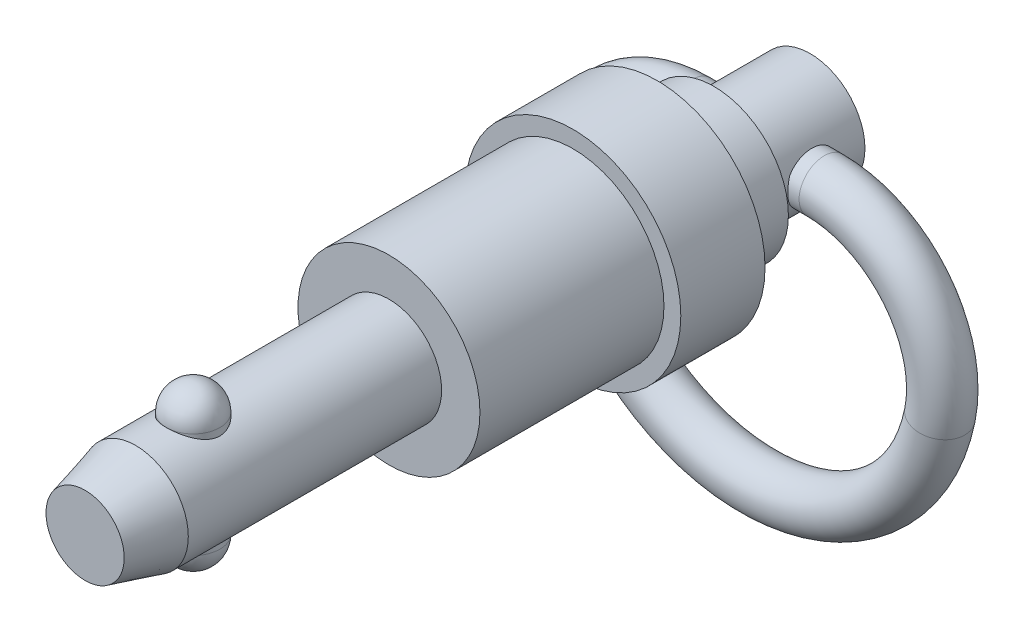
ISO-10303-21;
HEADER;
FILE_DESCRIPTION(('STEP AP214'),'2;1');
FILE_NAME('part.step','',(''),(''),'','','');
FILE_SCHEMA(('AUTOMOTIVE_DESIGN { 1 0 10303 214 1 1 1 1 }'));
ENDSEC;
DATA;
#1=APPLICATION_CONTEXT('core data for automotive mechanical design processes');
#2=APPLICATION_PROTOCOL_DEFINITION('international standard','automotive_design',2000,#1);
#3=PRODUCT_CONTEXT('',#1,'mechanical');
#4=PRODUCT('Part','Part','',(#3));
#5=PRODUCT_RELATED_PRODUCT_CATEGORY('part','',(#4));
#6=PRODUCT_DEFINITION_FORMATION('','',#4);
#7=PRODUCT_DEFINITION_CONTEXT('part definition',#1,'design');
#8=PRODUCT_DEFINITION('design','',#6,#7);
#9=PRODUCT_DEFINITION_SHAPE('','',#8);
#10=(LENGTH_UNIT() NAMED_UNIT(*) SI_UNIT(.MILLI.,.METRE.));
#11=(NAMED_UNIT(*) PLANE_ANGLE_UNIT() SI_UNIT($,.RADIAN.));
#12=(NAMED_UNIT(*) SI_UNIT($,.STERADIAN.) SOLID_ANGLE_UNIT());
#13=UNCERTAINTY_MEASURE_WITH_UNIT(LENGTH_MEASURE(1.E-05),#10,'distance_accuracy_value','');
#14=(GEOMETRIC_REPRESENTATION_CONTEXT(3) GLOBAL_UNCERTAINTY_ASSIGNED_CONTEXT((#13)) GLOBAL_UNIT_ASSIGNED_CONTEXT((#10,
#11,#12)) REPRESENTATION_CONTEXT('',''));
#15=CARTESIAN_POINT('',(0.,0.,0.));
#16=DIRECTION('',(0.,0.,1.));
#17=DIRECTION('',(1.,0.,0.));
#18=AXIS2_PLACEMENT_3D('',#15,#16,#17);
#19=CARTESIAN_POINT('',(0.,0.,6.25428571428572));
#20=DIRECTION('',(0.,0.,1.));
#21=DIRECTION('',(1.,0.,0.));
#22=AXIS2_PLACEMENT_3D('',#19,#20,#21);
#23=CYLINDRICAL_SURFACE('',#22,3.25);
#24=CARTESIAN_POINT('',(-2.88314064866769,1.50000000000001,-39.956));
#25=CARTESIAN_POINT('',(-2.8831457136264,1.49999556641994,-39.8769439023726));
#26=CARTESIAN_POINT('',(-2.88644015844544,1.49370969693479,-39.7977678873659));
#27=CARTESIAN_POINT('',(-2.89916399453696,1.46885414761838,-39.6417751471036));
#28=CARTESIAN_POINT('',(-2.9086081757042,1.45025485263673,-39.5649645782642));
#29=CARTESIAN_POINT('',(-2.93231396336259,1.4016968736993,-39.4162446356748));
#30=CARTESIAN_POINT('',(-2.9465528533482,1.37179167466407,-39.3443140372731));
#31=CARTESIAN_POINT('',(-2.9782090887604,1.30163233654913,-39.2065085108532));
#32=CARTESIAN_POINT('',(-2.99562617608213,1.26137903774135,-39.1406330917403));
#33=CARTESIAN_POINT('',(-3.03316714708754,1.16836618134816,-39.0117173133267));
#34=CARTESIAN_POINT('',(-3.05339509066289,1.11493024482924,-38.9491950168423));
#35=CARTESIAN_POINT('',(-3.09343234273965,0.998482280785288,-38.8336061903648));
#36=CARTESIAN_POINT('',(-3.11324146363631,0.935466061279206,-38.7805438218809));
#37=CARTESIAN_POINT('',(-3.15152392195906,0.797372263715609,-38.6825193567671));
#38=CARTESIAN_POINT('',(-3.16986256926451,0.72182005107809,-38.6381684379312));
#39=CARTESIAN_POINT('',(-3.20182516260171,0.563324090920352,-38.5630374816506));
#40=CARTESIAN_POINT('',(-3.21545165364737,0.480384363900056,-38.5322501161236));
#41=CARTESIAN_POINT('',(-3.23571086174561,0.314933648113417,-38.4870868303177));
#42=CARTESIAN_POINT('',(-3.24272563710553,0.232716432643617,-38.4718097892477));
#43=CARTESIAN_POINT('',(-3.25037878818967,0.0666076979909198,-38.4551600478439));
#44=CARTESIAN_POINT('',(-3.25102038740195,-0.0172829532677052,-38.4537803183854));
#45=CARTESIAN_POINT('',(-3.2460575180355,-0.177691624209244,-38.4645559898147));
#46=CARTESIAN_POINT('',(-3.24091400620298,-0.254293968157477,-38.4757124460504));
#47=CARTESIAN_POINT('',(-3.22562512287075,-0.404395406998716,-38.509492667503));
#48=CARTESIAN_POINT('',(-3.21547938016454,-0.477894271148601,-38.5321172837547));
#49=CARTESIAN_POINT('',(-3.19094774192041,-0.621056530120156,-38.5884120372744));
#50=CARTESIAN_POINT('',(-3.17650045920505,-0.690645751763829,-38.6222429450804));
#51=CARTESIAN_POINT('',(-3.14472149367112,-0.823340056563816,-38.6998059016657));
#52=CARTESIAN_POINT('',(-3.12738875365795,-0.886442749382061,-38.7435415815509));
#53=CARTESIAN_POINT('',(-3.08981116071687,-1.00998865129198,-38.8438963875093));
#54=CARTESIAN_POINT('',(-3.06944399350116,-1.06976897732309,-38.901286703642));
#55=CARTESIAN_POINT('',(-3.02909824323477,-1.17918246727279,-39.0252114945021));
#56=CARTESIAN_POINT('',(-3.00911988962755,-1.22880979481938,-39.0917511921404));
#57=CARTESIAN_POINT('',(-2.970824723522,-1.31879065623882,-39.2360306278498));
#58=CARTESIAN_POINT('',(-2.95263289679022,-1.35858783900657,-39.3141535824616));
#59=CARTESIAN_POINT('',(-2.92156472084363,-1.42418098595598,-39.4770441626027));
#60=CARTESIAN_POINT('',(-2.90868360135207,-1.44998952185268,-39.5618057432586));
#61=CARTESIAN_POINT('',(-2.89096621176897,-1.48498298275772,-39.7289218453229));
#62=CARTESIAN_POINT('',(-2.8856059064814,-1.49525517003751,-39.810991566225));
#63=CARTESIAN_POINT('',(-2.88203375109532,-1.50213248837152,-39.9758396139269));
#64=CARTESIAN_POINT('',(-2.88381831630823,-1.49874447294807,-40.0586175645999));
#65=CARTESIAN_POINT('',(-2.89378448222421,-1.47939407855596,-40.2149613185003));
#66=CARTESIAN_POINT('',(-2.90140090883,-1.46454174491478,-40.2887057624489));
#67=CARTESIAN_POINT('',(-2.9213910014952,-1.42424595450328,-40.4325566358553));
#68=CARTESIAN_POINT('',(-2.93376596655151,-1.39879960559705,-40.5026620659903));
#69=CARTESIAN_POINT('',(-2.96255754699623,-1.33677544030458,-40.6408576864714));
#70=CARTESIAN_POINT('',(-2.9791331860295,-1.29974156041787,-40.7087088874137));
#71=CARTESIAN_POINT('',(-3.01427720300401,-1.21601516610395,-40.837600782882));
#72=CARTESIAN_POINT('',(-3.03284655353677,-1.16931792720833,-40.8986381235192));
#73=CARTESIAN_POINT('',(-3.07221170888888,-1.06189125712979,-41.0187966196213));
#74=CARTESIAN_POINT('',(-3.09303821543065,-1.00020754623496,-41.0770582813347));
#75=CARTESIAN_POINT('',(-3.13284209138054,-0.867522200075307,-41.1826183562448));
#76=CARTESIAN_POINT('',(-3.15181910370929,-0.796518771650635,-41.2299146547945));
#77=CARTESIAN_POINT('',(-3.18614398952109,-0.645779611223695,-41.312632148265));
#78=CARTESIAN_POINT('',(-3.20144088338452,-0.565941369277075,-41.3478890867712));
#79=CARTESIAN_POINT('',(-3.22630112308052,-0.400564052656318,-41.404157970873));
#80=CARTESIAN_POINT('',(-3.23586873719673,-0.315029274796197,-41.425180522543));
#81=CARTESIAN_POINT('',(-3.24760255095982,-0.14827416267166,-41.4508372669131));
#82=CARTESIAN_POINT('',(-3.25031216242764,-0.067276561678827,-41.4566757876139));
#83=CARTESIAN_POINT('',(-3.24963056758422,0.0945622690764615,-41.4552001252417));
#84=CARTESIAN_POINT('',(-3.24624091728073,0.17540353345568,-41.4478892967536));
#85=CARTESIAN_POINT('',(-3.2340523596831,0.330377110165551,-41.421170361447));
#86=CARTESIAN_POINT('',(-3.22553506572324,0.404642109320082,-41.402391368417));
#87=CARTESIAN_POINT('',(-3.20414398077751,0.54889203308514,-41.3540369819461));
#88=CARTESIAN_POINT('',(-3.19126946858673,0.618876246876186,-41.32445980113));
#89=CARTESIAN_POINT('',(-3.16163485368075,0.756120738614416,-41.253885127286));
#90=CARTESIAN_POINT('',(-3.14472447718235,0.823111747237927,-41.2124288148364));
#91=CARTESIAN_POINT('',(-3.10890779784662,0.949480528445813,-41.1198845180357));
#92=CARTESIAN_POINT('',(-3.09000060866342,1.00885489403558,-41.068792248499));
#93=CARTESIAN_POINT('',(-3.05024317409845,1.12361573961566,-40.9533293805642));
#94=CARTESIAN_POINT('',(-3.02936483348881,1.1782291920865,-40.8881976189992));
#95=CARTESIAN_POINT('',(-2.98952045702794,1.27595496376298,-40.7491951270022));
#96=CARTESIAN_POINT('',(-2.97055573952619,1.31905938727256,-40.6753184470699));
#97=CARTESIAN_POINT('',(-2.93672337150169,1.39277649849145,-40.5196262272073));
#98=CARTESIAN_POINT('',(-2.92190329259102,1.42324593883139,-40.4377320066066));
#99=CARTESIAN_POINT('',(-2.8989091900939,1.46952814491982,-40.2691631985787));
#100=CARTESIAN_POINT('',(-2.89071286577159,1.48539011621651,-40.1825057095821));
#101=CARTESIAN_POINT('',(-2.88537886682203,1.49569022737935,-40.0719914262748));
#102=CARTESIAN_POINT('',(-2.88454161144603,1.49730457328773,-40.0488340087761));
#103=CARTESIAN_POINT('',(-2.88342174659473,1.49946013339423,-40.0024545146897));
#104=CARTESIAN_POINT('',(-2.88313916021418,1.50000130290853,-39.97923243545));
#105=CARTESIAN_POINT('',(-2.88314064866769,1.50000000000001,-39.956));
#106=B_SPLINE_CURVE_WITH_KNOTS('',3,(#24,#25,#26,#27,#28,#29,#30,#31,#32,#33,#34,#35,#36,#37,
#38,#39,#40,#41,#42,#43,#44,#45,#46,#47,#48,#49,#50,#51,#52,#53,#54,#55,#56,#57,#58,#59,#60,#61,
#62,#63,#64,#65,#66,#67,#68,#69,#70,#71,#72,#73,#74,#75,#76,#77,#78,#79,#80,#81,#82,#83,#84,#85,
#86,#87,#88,#89,#90,#91,#92,#93,#94,#95,#96,#97,#98,#99,#100,#101,#102,#103,#104,#105),
.UNSPECIFIED.,.T.,.F.,(4,2,2,2,2,2,2,2,2,2,2,2,2,2,2,2,2,2,2,2,2,2,2,2,2,2,2,2,2,2,2,2,2,2,2,2,
2,2,2,2,4),(0.,0.237070629842366,0.474713522307298,0.711245984859928,0.947759246897393,
1.20076595244836,1.45388368480718,1.72101627750577,1.98800436695452,2.23839767342451,
2.48866432703865,2.72031924760969,2.95199136146054,3.18714254087518,3.42238006705796,
3.67727504444585,3.93231613705003,4.19954224888931,4.46652780247585,4.71378889158368,
4.96092594164795,5.18674173400351,5.41261921389104,5.64883211936519,5.88516078461181,
6.14606812623412,6.40702574151085,6.67141336219645,6.93560376963526,7.17809302712592,
7.4205204309555,7.65071362192285,7.88094493301844,8.12166304311162,8.36248845593741,
8.62387073294539,8.88543187151776,9.14988229823361,9.4134386247824,9.48310433001488,
9.55277293585562),.UNSPECIFIED.);
#107=CARTESIAN_POINT('',(-2.88314064866769,1.50000000000001,-39.956));
#108=VERTEX_POINT('',#107);
#109=EDGE_CURVE('E37',#108,#108,#106,.T.);
#110=ORIENTED_EDGE('',*,*,#109,.T.);
#111=EDGE_LOOP('',(#110));
#112=FACE_BOUND('',#111,.T.);
#113=CARTESIAN_POINT('',(0.,0.,-43.034));
#114=DIRECTION('',(0.,0.,1.));
#115=DIRECTION('',(1.,0.,0.));
#116=AXIS2_PLACEMENT_3D('',#113,#114,#115);
#117=CIRCLE('',#116,3.25);
#118=CARTESIAN_POINT('',(3.25,0.,-43.034));
#119=VERTEX_POINT('',#118);
#120=EDGE_CURVE('E102',#119,#119,#117,.T.);
#121=ORIENTED_EDGE('',*,*,#120,.T.);
#122=EDGE_LOOP('',(#121));
#123=FACE_BOUND('',#122,.T.);
#124=CARTESIAN_POINT('',(0.,0.,-37.3248057229389));
#125=DIRECTION('',(0.,0.,1.));
#126=DIRECTION('',(1.,0.,0.));
#127=AXIS2_PLACEMENT_3D('',#124,#125,#126);
#128=CIRCLE('',#127,3.25);
#129=CARTESIAN_POINT('',(3.25,0.,-37.3248057229389));
#130=VERTEX_POINT('',#129);
#131=EDGE_CURVE('E105',#130,#130,#128,.T.);
#132=ORIENTED_EDGE('',*,*,#131,.F.);
#133=EDGE_LOOP('',(#132));
#134=FACE_BOUND('',#133,.T.);
#135=DIRECTION('',(0.,0.,1.));
#136=VECTOR('',#135,1.);
#137=CARTESIAN_POINT('',(3.1669279619635,0.730114568909381,6.25428571428572));
#138=LINE('',#137,#136);
#139=CARTESIAN_POINT('',(3.16692796196349,0.7301145689094,-41.2663177920895));
#140=VERTEX_POINT('',#139);
#141=CARTESIAN_POINT('',(3.16692796196349,0.7301145689094,-38.6456822079105));
#142=VERTEX_POINT('',#141);
#143=EDGE_CURVE('E11',#140,#142,#138,.T.);
#144=ORIENTED_EDGE('',*,*,#143,.F.);
#145=CARTESIAN_POINT('',(3.1669279619635,-0.730114568909364,-41.2663177920895));
#146=CARTESIAN_POINT('',(3.17477812871847,-0.696069146946287,-41.2852865860589));
#147=CARTESIAN_POINT('',(3.18223050407613,-0.66122705318097,-41.3029620226422));
#148=CARTESIAN_POINT('',(3.19618472787284,-0.590099894541834,-41.3356074102154));
#149=CARTESIAN_POINT('',(3.20268623428273,-0.553814316384759,-41.3505763881429));
#150=CARTESIAN_POINT('',(3.22051985037927,-0.443079942811696,-41.3912173457534));
#151=CARTESIAN_POINT('',(3.23018642405055,-0.366730915200321,-41.4126359817005));
#152=CARTESIAN_POINT('',(3.24409176346839,-0.210955856866205,-41.4432183039742));
#153=CARTESIAN_POINT('',(3.24831716507972,-0.131522741830527,-41.4523518190895));
#154=CARTESIAN_POINT('',(3.25085574939785,0.0278335734257613,-41.4578557403568));
#155=CARTESIAN_POINT('',(3.24917358141081,0.107756338854352,-41.4542361832749));
#156=CARTESIAN_POINT('',(3.24024940342909,0.262913251111518,-41.4347776120421));
#157=CARTESIAN_POINT('',(3.2332029925366,0.338213759957443,-41.4193683929166));
#158=CARTESIAN_POINT('',(3.21445789285293,0.484992854305343,-41.3774766433813));
#159=CARTESIAN_POINT('',(3.20276274415573,0.556474301208267,-41.3510025382853));
#160=CARTESIAN_POINT('',(3.18229078761226,0.66096955884618,-41.3030998507494));
#161=CARTESIAN_POINT('',(3.17481063559193,0.695967991788788,-41.2853561534402));
#162=CARTESIAN_POINT('',(3.16692796196349,0.7301145689094,-41.2663177920895));
#163=B_SPLINE_CURVE_WITH_KNOTS('',3,(#145,#146,#147,#148,#149,#150,#151,#152,#153,#154,#155,
#156,#157,#158,#159,#160,#161,#162),.UNSPECIFIED.,.F.,.F.,(4,2,2,2,2,2,2,2,4),(0.,
0.119206588612702,0.23845595113056,0.476876319824998,0.715881166013012,0.954697955576474,
1.18520057951607,1.41552800698886,1.53521799831091),.UNSPECIFIED.);
#164=CARTESIAN_POINT('',(3.1669279619635,-0.730114568909383,-41.2663177920895));
#165=VERTEX_POINT('',#164);
#166=EDGE_CURVE('E46',#165,#140,#163,.T.);
#167=ORIENTED_EDGE('',*,*,#166,.F.);
#168=DIRECTION('',(0.,0.,1.));
#169=VECTOR('',#168,1.);
#170=CARTESIAN_POINT('',(3.1669279619635,-0.730114568909383,6.25428571428572));
#171=LINE('',#170,#169);
#172=CARTESIAN_POINT('',(3.1669279619635,-0.730114568909383,-38.6456822079105));
#173=VERTEX_POINT('',#172);
#174=EDGE_CURVE('E73',#173,#165,#171,.F.);
#175=ORIENTED_EDGE('',*,*,#174,.F.);
#176=CARTESIAN_POINT('',(3.16692796196349,0.7301145689094,-38.6456822079105));
#177=CARTESIAN_POINT('',(3.17477812871847,0.696069146946323,-38.6267134139411));
#178=CARTESIAN_POINT('',(3.18223050407613,0.661227053181006,-38.6090379773578));
#179=CARTESIAN_POINT('',(3.19618472787283,0.59009989454187,-38.5763925897845));
#180=CARTESIAN_POINT('',(3.20268623428272,0.553814316384795,-38.5614236118571));
#181=CARTESIAN_POINT('',(3.22051985037926,0.443079942811732,-38.5207826542466));
#182=CARTESIAN_POINT('',(3.23018642405054,0.366730915200357,-38.4993640182994));
#183=CARTESIAN_POINT('',(3.24409176346839,0.210955856866241,-38.4687816960257));
#184=CARTESIAN_POINT('',(3.24831716507972,0.131522741830563,-38.4596481809105));
#185=CARTESIAN_POINT('',(3.25085574939785,-0.0278335734257254,-38.4541442596432));
#186=CARTESIAN_POINT('',(3.24917358141081,-0.107756338854316,-38.4577638167251));
#187=CARTESIAN_POINT('',(3.2402494034291,-0.262913251111482,-38.4772223879579));
#188=CARTESIAN_POINT('',(3.2332029925366,-0.338213759957407,-38.4926316070834));
#189=CARTESIAN_POINT('',(3.21445789285293,-0.484992854305307,-38.5345233566186));
#190=CARTESIAN_POINT('',(3.20276274415574,-0.556474301208231,-38.5609974617147));
#191=CARTESIAN_POINT('',(3.18229078761227,-0.660969558846145,-38.6089001492506));
#192=CARTESIAN_POINT('',(3.17481063559194,-0.695967991788753,-38.6266438465598));
#193=CARTESIAN_POINT('',(3.1669279619635,-0.730114568909365,-38.6456822079105));
#194=B_SPLINE_CURVE_WITH_KNOTS('',3,(#176,#177,#178,#179,#180,#181,#182,#183,#184,#185,#186,
#187,#188,#189,#190,#191,#192,#193),.UNSPECIFIED.,.F.,.F.,(4,2,2,2,2,2,2,2,4),(0.,
0.119206588612702,0.238455951130561,0.476876319824999,0.715881166013013,0.954697955576475,
1.18520057951607,1.41552800698886,1.53521799831091),.UNSPECIFIED.);
#195=EDGE_CURVE('E56',#142,#173,#194,.T.);
#196=ORIENTED_EDGE('',*,*,#195,.F.);
#197=EDGE_LOOP('',(#144,#167,#175,#196));
#198=FACE_BOUND('',#197,.T.);
#199=ADVANCED_FACE('F33',(#112,#123,#134,#198),#23,.T.);
#200=CARTESIAN_POINT('',(0.,0.,6.25428571428572));
#201=DIRECTION('',(0.,0.,1.));
#202=DIRECTION('',(1.,0.,0.));
#203=AXIS2_PLACEMENT_3D('',#200,#201,#202);
#204=CYLINDRICAL_SURFACE('',#203,3.125);
#205=CARTESIAN_POINT('',(0.,3.125,-4.83));
#206=CARTESIAN_POINT('',(0.0831819560036795,3.1249953597737,-4.83000531293494));
#207=CARTESIAN_POINT('',(0.166458738050427,3.12164337875091,-4.83658659131712));
#208=CARTESIAN_POINT('',(0.330541889055943,3.10856452130944,-4.86261631272224));
#209=CARTESIAN_POINT('',(0.411343464796468,3.09882600501453,-4.88208825042568));
#210=CARTESIAN_POINT('',(0.56785400232666,3.0739912127497,-4.93293705239859));
#211=CARTESIAN_POINT('',(0.643581588133108,3.05891597019821,-4.96426721340223));
#212=CARTESIAN_POINT('',(0.788588129506028,3.0247827320142,-5.03769638318395));
#213=CARTESIAN_POINT('',(0.857867473094102,3.00572497625282,-5.07979474341579));
#214=CARTESIAN_POINT('',(0.992820833129824,2.96398780538595,-5.17651576757561));
#215=CARTESIAN_POINT('',(1.05800835206069,2.94115745230686,-5.23175110409235));
#216=CARTESIAN_POINT('',(1.1786447839529,2.89492708805978,-5.35185561765864));
#217=CARTESIAN_POINT('',(1.23408604378523,2.87152664550659,-5.41673229233842));
#218=CARTESIAN_POINT('',(1.33813019159169,2.8246319891775,-5.56052645061241));
#219=CARTESIAN_POINT('',(1.38582507289414,2.80128145857178,-5.64015340088664));
#220=CARTESIAN_POINT('',(1.46694520834969,2.75967185077811,-5.80760141635835));
#221=CARTESIAN_POINT('',(1.5003808642591,2.74140906558825,-5.89541645136434));
#222=CARTESIAN_POINT('',(1.54982297122465,2.71374980032607,-6.07133968962958));
#223=CARTESIAN_POINT('',(1.56676247174937,2.70388327498677,-6.15910794298838));
#224=CARTESIAN_POINT('',(1.58557765171155,2.692898332245,-6.33674869716092));
#225=CARTESIAN_POINT('',(1.58746901531716,2.6917708065082,-6.42661890913109));
#226=CARTESIAN_POINT('',(1.57681774130044,2.69801535389337,-6.59392674449302));
#227=CARTESIAN_POINT('',(1.56603504753052,2.70435127900627,-6.67152472219822));
#228=CARTESIAN_POINT('',(1.53339986928602,2.72298722243995,-6.82360924772027));
#229=CARTESIAN_POINT('',(1.5115436823872,2.73528923546428,-6.89809474585669));
#230=CARTESIAN_POINT('',(1.45699446648516,2.76473634678218,-7.0439685200987));
#231=CARTESIAN_POINT('',(1.42406165063412,2.78198724236301,-7.11524475883745));
#232=CARTESIAN_POINT('',(1.34848035503859,2.81939748156295,-7.25160618782758));
#233=CARTESIAN_POINT('',(1.30582750729558,2.83955813127247,-7.31668857598258));
#234=CARTESIAN_POINT('',(1.20550649598987,2.88370540429658,-7.44778914524654));
#235=CARTESIAN_POINT('',(1.14660337333784,2.9078472842294,-7.5128133793791));
#236=CARTESIAN_POINT('',(1.01864665663228,2.95510353539607,-7.63248191727784));
#237=CARTESIAN_POINT('',(0.949587970161362,2.9782173835147,-7.68712098179673));
#238=CARTESIAN_POINT('',(0.798999168044061,3.02219561920157,-7.78699721263472));
#239=CARTESIAN_POINT('',(0.717023383271341,3.04289398651829,-7.8316415159618));
#240=CARTESIAN_POINT('',(0.545410515011378,3.07827916023055,-7.90613438349139));
#241=CARTESIAN_POINT('',(0.455779749500507,3.09297086730544,-7.93599501352517));
#242=CARTESIAN_POINT('',(0.279509949995261,3.11363121532378,-7.97756013736392));
#243=CARTESIAN_POINT('',(0.193256918997877,3.12023144566575,-7.99058433662759));
#244=CARTESIAN_POINT('',(0.0195503728167121,3.12614454928154,-8.00226454789234));
#245=CARTESIAN_POINT('',(-0.0679025272573843,3.1254610266843,-8.00092766600603));
#246=CARTESIAN_POINT('',(-0.234056258827922,3.11724404058317,-7.98466545472652));
#247=CARTESIAN_POINT('',(-0.312896184586064,3.11026476195674,-7.97083935697533));
#248=CARTESIAN_POINT('',(-0.466971414062995,3.09088888309723,-7.931733917838));
#249=CARTESIAN_POINT('',(-0.542206324470062,3.07849169324972,-7.9064533298843));
#250=CARTESIAN_POINT('',(-0.689379524554156,3.04896298664643,-7.84452276412199));
#251=CARTESIAN_POINT('',(-0.761166951466517,3.03170885790569,-7.80757482945663));
#252=CARTESIAN_POINT('',(-0.897754755724616,2.99410882737571,-7.72369871743499));
#253=CARTESIAN_POINT('',(-0.962552180856395,2.9737616279066,-7.67676634784998));
#254=CARTESIAN_POINT('',(-1.09022011786486,2.92951435093344,-7.56882667305931));
#255=CARTESIAN_POINT('',(-1.1522449022577,2.90546263535655,-7.50687961150624));
#256=CARTESIAN_POINT('',(-1.26541238757697,2.85799407537747,-7.37344554272468));
#257=CARTESIAN_POINT('',(-1.31654701891961,2.83457771290456,-7.30195152460118));
#258=CARTESIAN_POINT('',(-1.40901706633433,2.78981627076825,-7.14675815221161));
#259=CARTESIAN_POINT('',(-1.4497004612319,2.76864346653504,-7.06261612370357));
#260=CARTESIAN_POINT('',(-1.51589557665398,2.73296903382979,-6.88726789132179));
#261=CARTESIAN_POINT('',(-1.5414273755794,2.71845858242522,-6.79607121811233));
#262=CARTESIAN_POINT('',(-1.57419598836468,2.69960324281717,-6.61862975942801));
#263=CARTESIAN_POINT('',(-1.5829645090246,2.69441029928514,-6.53276015768592));
#264=CARTESIAN_POINT('',(-1.58640107691418,2.69239040033587,-6.36065744059672));
#265=CARTESIAN_POINT('',(-1.58107585538213,2.69555945118817,-6.27442451841444));
#266=CARTESIAN_POINT('',(-1.55791806177066,2.7089962942238,-6.11320856795925));
#267=CARTESIAN_POINT('',(-1.54139782788283,2.71851776397401,-6.03796660094433));
#268=CARTESIAN_POINT('',(-1.49797525195891,2.74268277065316,-5.89141623084022));
#269=CARTESIAN_POINT('',(-1.47106948825623,2.75732799553006,-5.82010913301087));
#270=CARTESIAN_POINT('',(-1.40563260218575,2.79128354123014,-5.67815848567325));
#271=CARTESIAN_POINT('',(-1.36644381369075,2.81084052841764,-5.60787891469849));
#272=CARTESIAN_POINT('',(-1.27826337561332,2.85202304772409,-5.4744300686923));
#273=CARTESIAN_POINT('',(-1.22926655425869,2.87364966800639,-5.4112645724851));
#274=CARTESIAN_POINT('',(-1.11560884927019,2.91980449256874,-5.28553122980272));
#275=CARTESIAN_POINT('',(-1.04975102005973,2.94435406360807,-5.22404725220981));
#276=CARTESIAN_POINT('',(-0.908001723409461,2.99110751963228,-5.11274112565225));
#277=CARTESIAN_POINT('',(-0.832104688296793,3.01331009060395,-5.06292549065798));
#278=CARTESIAN_POINT('',(-0.671095309266771,3.0532284983528,-4.97614444275961));
#279=CARTESIAN_POINT('',(-0.585895695122019,3.07089550476038,-4.93931740609305));
#280=CARTESIAN_POINT('',(-0.409449430678033,3.09933855639821,-4.88100016568858));
#281=CARTESIAN_POINT('',(-0.318220562097705,3.11013394725519,-4.85946688551426));
#282=CARTESIAN_POINT('',(-0.188347567687539,3.1195457719316,-4.84077630769528));
#283=CARTESIAN_POINT('',(-0.150828119991369,3.12158543102732,-4.83674127397811));
#284=CARTESIAN_POINT('',(-0.0755456405084613,3.12431361719344,-4.83135187721472));
#285=CARTESIAN_POINT('',(-0.0377826021516996,3.12500210766653,-4.82999758677824));
#286=CARTESIAN_POINT('',(0.,3.125,-4.83));
#287=B_SPLINE_CURVE_WITH_KNOTS('',3,(#205,#206,#207,#208,#209,#210,#211,#212,#213,#214,#215,
#216,#217,#218,#219,#220,#221,#222,#223,#224,#225,#226,#227,#228,#229,#230,#231,#232,#233,#234,
#235,#236,#237,#238,#239,#240,#241,#242,#243,#244,#245,#246,#247,#248,#249,#250,#251,#252,#253,
#254,#255,#256,#257,#258,#259,#260,#261,#262,#263,#264,#265,#266,#267,#268,#269,#270,#271,#272,
#273,#274,#275,#276,#277,#278,#279,#280,#281,#282,#283,#284,#285,#286),.UNSPECIFIED.,.T.,.F.,(4,
2,2,2,2,2,2,2,2,2,2,2,2,2,2,2,2,2,2,2,2,2,2,2,2,2,2,2,2,2,2,2,2,2,2,2,2,2,2,2,4),(0.,
0.249392761395435,0.499241325287087,0.748115938081181,0.996975565203247,1.2611961774379,
1.52562334777589,1.81130744781786,2.09678279033736,2.36496627780812,2.63287020996443,
2.86756922309894,3.10234675972316,3.34257438554211,3.58291017873903,3.85472484507967,
4.12667627819111,4.41197141695275,4.69703332401996,4.95803523284515,5.21890799933967,
5.45884290787773,5.69880393429056,5.94547022452558,6.19224028925196,6.46377114725518,
6.73550251441539,7.02143922791222,7.30699617633997,7.56491139759847,7.8227034595525,
8.05455773741497,8.28648846839303,8.53394546249952,8.78153328594621,9.060403255049,
9.33942853704919,9.62134253601313,9.90245931199944,10.0157345068379,10.1290127697692),.UNSPECIFIED.);
#288=CARTESIAN_POINT('',(0.,3.125,-4.83));
#289=VERTEX_POINT('',#288);
#290=CARTESIAN_POINT('',(0.,3.125,-8.));
#291=VERTEX_POINT('',#290);
#292=EDGE_CURVE('E142',#289,#291,#287,.T.);
#293=ORIENTED_EDGE('',*,*,#292,.F.);
#294=EDGE_CURVE('E135',#291,#289,#287,.T.);
#295=ORIENTED_EDGE('',*,*,#294,.F.);
#296=EDGE_LOOP('',(#293,#295));
#297=FACE_BOUND('',#296,.T.);
#298=CARTESIAN_POINT('',(0.,0.,-3.00000000000004));
#299=DIRECTION('',(0.,0.,-1.));
#300=DIRECTION('',(-1.,0.,0.));
#301=AXIS2_PLACEMENT_3D('',#298,#299,#300);
#302=CIRCLE('',#301,3.125);
#303=CARTESIAN_POINT('',(-3.125,0.,-3.00000000000004));
#304=VERTEX_POINT('',#303);
#305=EDGE_CURVE('E132',#304,#304,#302,.T.);
#306=ORIENTED_EDGE('',*,*,#305,.T.);
#307=EDGE_LOOP('',(#306));
#308=FACE_BOUND('',#307,.T.);
#309=CARTESIAN_POINT('',(0.,0.,-18.034));
#310=DIRECTION('',(0.,0.,1.));
#311=DIRECTION('',(1.,0.,0.));
#312=AXIS2_PLACEMENT_3D('',#309,#310,#311);
#313=CIRCLE('',#312,3.125);
#314=CARTESIAN_POINT('',(3.125,0.,-18.034));
#315=VERTEX_POINT('',#314);
#316=EDGE_CURVE('E126',#315,#315,#313,.T.);
#317=ORIENTED_EDGE('',*,*,#316,.T.);
#318=EDGE_LOOP('',(#317));
#319=FACE_BOUND('',#318,.T.);
#320=CARTESIAN_POINT('',(0.,-3.125,-4.83));
#321=CARTESIAN_POINT('',(-0.0831819560036795,-3.1249953597737,-4.83000531293494));
#322=CARTESIAN_POINT('',(-0.166458738050427,-3.12164337875091,-4.83658659131712));
#323=CARTESIAN_POINT('',(-0.330541889055943,-3.10856452130944,-4.86261631272224));
#324=CARTESIAN_POINT('',(-0.411343464796468,-3.09882600501453,-4.88208825042568));
#325=CARTESIAN_POINT('',(-0.56785400232666,-3.0739912127497,-4.93293705239859));
#326=CARTESIAN_POINT('',(-0.643581588133108,-3.05891597019821,-4.96426721340223));
#327=CARTESIAN_POINT('',(-0.788588129506028,-3.0247827320142,-5.03769638318395));
#328=CARTESIAN_POINT('',(-0.857867473094102,-3.00572497625282,-5.07979474341579));
#329=CARTESIAN_POINT('',(-0.992820833129824,-2.96398780538595,-5.17651576757561));
#330=CARTESIAN_POINT('',(-1.05800835206069,-2.94115745230686,-5.23175110409235));
#331=CARTESIAN_POINT('',(-1.1786447839529,-2.89492708805978,-5.35185561765864));
#332=CARTESIAN_POINT('',(-1.23408604378523,-2.87152664550659,-5.41673229233842));
#333=CARTESIAN_POINT('',(-1.33813019159169,-2.8246319891775,-5.56052645061241));
#334=CARTESIAN_POINT('',(-1.38582507289414,-2.80128145857178,-5.64015340088664));
#335=CARTESIAN_POINT('',(-1.46694520834969,-2.75967185077811,-5.80760141635835));
#336=CARTESIAN_POINT('',(-1.5003808642591,-2.74140906558825,-5.89541645136434));
#337=CARTESIAN_POINT('',(-1.54982297122465,-2.71374980032607,-6.07133968962958));
#338=CARTESIAN_POINT('',(-1.56676247174937,-2.70388327498677,-6.15910794298838));
#339=CARTESIAN_POINT('',(-1.58557765171155,-2.692898332245,-6.33674869716092));
#340=CARTESIAN_POINT('',(-1.58746901531716,-2.6917708065082,-6.42661890913109));
#341=CARTESIAN_POINT('',(-1.57681774130044,-2.69801535389337,-6.59392674449302));
#342=CARTESIAN_POINT('',(-1.56603504753052,-2.70435127900627,-6.67152472219822));
#343=CARTESIAN_POINT('',(-1.53339986928602,-2.72298722243995,-6.82360924772027));
#344=CARTESIAN_POINT('',(-1.5115436823872,-2.73528923546428,-6.89809474585669));
#345=CARTESIAN_POINT('',(-1.45699446648516,-2.76473634678218,-7.0439685200987));
#346=CARTESIAN_POINT('',(-1.42406165063412,-2.78198724236301,-7.11524475883745));
#347=CARTESIAN_POINT('',(-1.34848035503859,-2.81939748156295,-7.25160618782758));
#348=CARTESIAN_POINT('',(-1.30582750729558,-2.83955813127247,-7.31668857598258));
#349=CARTESIAN_POINT('',(-1.20550649598987,-2.88370540429658,-7.44778914524654));
#350=CARTESIAN_POINT('',(-1.14660337333784,-2.9078472842294,-7.5128133793791));
#351=CARTESIAN_POINT('',(-1.01864665663228,-2.95510353539607,-7.63248191727784));
#352=CARTESIAN_POINT('',(-0.949587970161362,-2.9782173835147,-7.68712098179673));
#353=CARTESIAN_POINT('',(-0.798999168044061,-3.02219561920157,-7.78699721263472));
#354=CARTESIAN_POINT('',(-0.717023383271341,-3.04289398651829,-7.8316415159618));
#355=CARTESIAN_POINT('',(-0.545410515011378,-3.07827916023055,-7.90613438349139));
#356=CARTESIAN_POINT('',(-0.455779749500507,-3.09297086730544,-7.93599501352517));
#357=CARTESIAN_POINT('',(-0.279509949995261,-3.11363121532378,-7.97756013736392));
#358=CARTESIAN_POINT('',(-0.193256918997877,-3.12023144566575,-7.99058433662759));
#359=CARTESIAN_POINT('',(-0.0195503728167121,-3.12614454928154,-8.00226454789234));
#360=CARTESIAN_POINT('',(0.0679025272573843,-3.1254610266843,-8.00092766600603));
#361=CARTESIAN_POINT('',(0.234056258827922,-3.11724404058317,-7.98466545472652));
#362=CARTESIAN_POINT('',(0.312896184586064,-3.11026476195674,-7.97083935697533));
#363=CARTESIAN_POINT('',(0.466971414062995,-3.09088888309723,-7.931733917838));
#364=CARTESIAN_POINT('',(0.542206324470062,-3.07849169324972,-7.9064533298843));
#365=CARTESIAN_POINT('',(0.689379524554156,-3.04896298664643,-7.84452276412199));
#366=CARTESIAN_POINT('',(0.761166951466517,-3.03170885790569,-7.80757482945663));
#367=CARTESIAN_POINT('',(0.897754755724616,-2.99410882737571,-7.72369871743499));
#368=CARTESIAN_POINT('',(0.962552180856395,-2.9737616279066,-7.67676634784998));
#369=CARTESIAN_POINT('',(1.09022011786486,-2.92951435093344,-7.56882667305931));
#370=CARTESIAN_POINT('',(1.1522449022577,-2.90546263535655,-7.50687961150624));
#371=CARTESIAN_POINT('',(1.26541238757697,-2.85799407537747,-7.37344554272468));
#372=CARTESIAN_POINT('',(1.31654701891961,-2.83457771290456,-7.30195152460118));
#373=CARTESIAN_POINT('',(1.40901706633433,-2.78981627076825,-7.14675815221161));
#374=CARTESIAN_POINT('',(1.4497004612319,-2.76864346653504,-7.06261612370357));
#375=CARTESIAN_POINT('',(1.51589557665398,-2.73296903382979,-6.88726789132179));
#376=CARTESIAN_POINT('',(1.5414273755794,-2.71845858242522,-6.79607121811233));
#377=CARTESIAN_POINT('',(1.57419598836468,-2.69960324281717,-6.61862975942801));
#378=CARTESIAN_POINT('',(1.5829645090246,-2.69441029928514,-6.53276015768592));
#379=CARTESIAN_POINT('',(1.58640107691418,-2.69239040033587,-6.36065744059672));
#380=CARTESIAN_POINT('',(1.58107585538213,-2.69555945118817,-6.27442451841444));
#381=CARTESIAN_POINT('',(1.55791806177066,-2.7089962942238,-6.11320856795925));
#382=CARTESIAN_POINT('',(1.54139782788283,-2.71851776397401,-6.03796660094433));
#383=CARTESIAN_POINT('',(1.49797525195891,-2.74268277065316,-5.89141623084022));
#384=CARTESIAN_POINT('',(1.47106948825623,-2.75732799553006,-5.82010913301087));
#385=CARTESIAN_POINT('',(1.40563260218575,-2.79128354123014,-5.67815848567325));
#386=CARTESIAN_POINT('',(1.36644381369075,-2.81084052841764,-5.60787891469849));
#387=CARTESIAN_POINT('',(1.27826337561332,-2.85202304772409,-5.4744300686923));
#388=CARTESIAN_POINT('',(1.22926655425869,-2.87364966800639,-5.4112645724851));
#389=CARTESIAN_POINT('',(1.11560884927019,-2.91980449256874,-5.28553122980272));
#390=CARTESIAN_POINT('',(1.04975102005973,-2.94435406360807,-5.22404725220981));
#391=CARTESIAN_POINT('',(0.908001723409461,-2.99110751963228,-5.11274112565225));
#392=CARTESIAN_POINT('',(0.832104688296793,-3.01331009060395,-5.06292549065798));
#393=CARTESIAN_POINT('',(0.671095309266771,-3.0532284983528,-4.97614444275961));
#394=CARTESIAN_POINT('',(0.585895695122019,-3.07089550476038,-4.93931740609305));
#395=CARTESIAN_POINT('',(0.409449430678033,-3.09933855639821,-4.88100016568858));
#396=CARTESIAN_POINT('',(0.318220562097705,-3.11013394725519,-4.85946688551426));
#397=CARTESIAN_POINT('',(0.188347567687539,-3.1195457719316,-4.84077630769528));
#398=CARTESIAN_POINT('',(0.150828119991369,-3.12158543102732,-4.83674127397811));
#399=CARTESIAN_POINT('',(0.0755456405084613,-3.12431361719344,-4.83135187721472));
#400=CARTESIAN_POINT('',(0.0377826021516996,-3.12500210766653,-4.82999758677824));
#401=CARTESIAN_POINT('',(0.,-3.125,-4.83));
#402=B_SPLINE_CURVE_WITH_KNOTS('',3,(#320,#321,#322,#323,#324,#325,#326,#327,#328,#329,#330,
#331,#332,#333,#334,#335,#336,#337,#338,#339,#340,#341,#342,#343,#344,#345,#346,#347,#348,#349,
#350,#351,#352,#353,#354,#355,#356,#357,#358,#359,#360,#361,#362,#363,#364,#365,#366,#367,#368,
#369,#370,#371,#372,#373,#374,#375,#376,#377,#378,#379,#380,#381,#382,#383,#384,#385,#386,#387,
#388,#389,#390,#391,#392,#393,#394,#395,#396,#397,#398,#399,#400,#401),.UNSPECIFIED.,.T.,.F.,(4,
2,2,2,2,2,2,2,2,2,2,2,2,2,2,2,2,2,2,2,2,2,2,2,2,2,2,2,2,2,2,2,2,2,2,2,2,2,2,2,4),(0.,
0.249392761395435,0.499241325287087,0.748115938081181,0.996975565203247,1.2611961774379,
1.52562334777589,1.81130744781786,2.09678279033736,2.36496627780812,2.63287020996443,
2.86756922309894,3.10234675972316,3.34257438554211,3.58291017873903,3.85472484507967,
4.12667627819111,4.41197141695275,4.69703332401996,4.95803523284515,5.21890799933967,
5.45884290787773,5.69880393429056,5.94547022452558,6.19224028925196,6.46377114725518,
6.73550251441539,7.02143922791222,7.30699617633997,7.56491139759847,7.8227034595525,
8.05455773741497,8.28648846839303,8.53394546249952,8.78153328594621,9.060403255049,
9.33942853704919,9.62134253601313,9.90245931199944,10.0157345068379,10.1290127697692),.UNSPECIFIED.);
#403=CARTESIAN_POINT('',(0.,-3.125,-4.83));
#404=VERTEX_POINT('',#403);
#405=CARTESIAN_POINT('',(0.,-3.125,-8.));
#406=VERTEX_POINT('',#405);
#407=EDGE_CURVE('E83',#404,#406,#402,.T.);
#408=ORIENTED_EDGE('',*,*,#407,.F.);
#409=EDGE_CURVE('E143',#406,#404,#402,.T.);
#410=ORIENTED_EDGE('',*,*,#409,.F.);
#411=EDGE_LOOP('',(#408,#410));
#412=FACE_BOUND('',#411,.T.);
#413=ADVANCED_FACE('F146',(#297,#308,#319,#412),#204,.T.);
#414=CARTESIAN_POINT('',(0.,0.,0.));
#415=DIRECTION('',(0.,0.,-1.));
#416=DIRECTION('',(-1.,0.,0.));
#417=AXIS2_PLACEMENT_3D('',#414,#415,#416);
#418=PLANE('',#417);
#419=CARTESIAN_POINT('',(0.,0.,0.));
#420=DIRECTION('',(0.,0.,-1.));
#421=DIRECTION('',(-1.,0.,0.));
#422=AXIS2_PLACEMENT_3D('',#419,#420,#421);
#423=CIRCLE('',#422,2.32115242270663);
#424=CARTESIAN_POINT('',(-2.32115242270663,0.,0.));
#425=VERTEX_POINT('',#424);
#426=EDGE_CURVE('E129',#425,#425,#423,.F.);
#427=ORIENTED_EDGE('',*,*,#426,.T.);
#428=EDGE_LOOP('',(#427));
#429=FACE_BOUND('',#428,.T.);
#430=ADVANCED_FACE('F210',(#429),#418,.F.);
#431=CARTESIAN_POINT('',(0.,3.125,-18.034));
#432=DIRECTION('',(0.,0.,-1.));
#433=DIRECTION('',(-1.,0.,0.));
#434=AXIS2_PLACEMENT_3D('',#431,#432,#433);
#435=PLANE('',#434);
#436=ORIENTED_EDGE('',*,*,#316,.F.);
#437=EDGE_LOOP('',(#436));
#438=FACE_BOUND('',#437,.T.);
#439=CARTESIAN_POINT('',(0.,0.,-18.034));
#440=DIRECTION('',(0.,0.,1.));
#441=DIRECTION('',(1.,0.,0.));
#442=AXIS2_PLACEMENT_3D('',#439,#440,#441);
#443=CIRCLE('',#442,5.4);
#444=CARTESIAN_POINT('',(5.4,0.,-18.034));
#445=VERTEX_POINT('',#444);
#446=EDGE_CURVE('E123',#445,#445,#443,.T.);
#447=ORIENTED_EDGE('',*,*,#446,.T.);
#448=EDGE_LOOP('',(#447));
#449=FACE_BOUND('',#448,.T.);
#450=ADVANCED_FACE('F207',(#438,#449),#435,.F.);
#451=CARTESIAN_POINT('',(0.,0.,6.25428571428572));
#452=DIRECTION('',(0.,0.,1.));
#453=DIRECTION('',(1.,0.,0.));
#454=AXIS2_PLACEMENT_3D('',#451,#452,#453);
#455=CYLINDRICAL_SURFACE('',#454,5.4);
#456=ORIENTED_EDGE('',*,*,#446,.F.);
#457=EDGE_LOOP('',(#456));
#458=FACE_BOUND('',#457,.T.);
#459=CARTESIAN_POINT('',(0.,0.,-28.956));
#460=DIRECTION('',(0.,0.,1.));
#461=DIRECTION('',(1.,0.,0.));
#462=AXIS2_PLACEMENT_3D('',#459,#460,#461);
#463=CIRCLE('',#462,5.4);
#464=CARTESIAN_POINT('',(5.4,0.,-28.956));
#465=VERTEX_POINT('',#464);
#466=EDGE_CURVE('E120',#465,#465,#463,.T.);
#467=ORIENTED_EDGE('',*,*,#466,.T.);
#468=EDGE_LOOP('',(#467));
#469=FACE_BOUND('',#468,.T.);
#470=ADVANCED_FACE('F204',(#458,#469),#455,.T.);
#471=CARTESIAN_POINT('',(0.,5.4,-28.956));
#472=DIRECTION('',(0.,0.,-1.));
#473=DIRECTION('',(-1.,0.,0.));
#474=AXIS2_PLACEMENT_3D('',#471,#472,#473);
#475=PLANE('',#474);
#476=ORIENTED_EDGE('',*,*,#466,.F.);
#477=EDGE_LOOP('',(#476));
#478=FACE_BOUND('',#477,.T.);
#479=CARTESIAN_POINT('',(0.,0.,-28.956));
#480=DIRECTION('',(0.,0.,1.));
#481=DIRECTION('',(1.,0.,0.));
#482=AXIS2_PLACEMENT_3D('',#479,#480,#481);
#483=CIRCLE('',#482,6.4);
#484=CARTESIAN_POINT('',(6.4,0.,-28.956));
#485=VERTEX_POINT('',#484);
#486=EDGE_CURVE('E117',#485,#485,#483,.T.);
#487=ORIENTED_EDGE('',*,*,#486,.T.);
#488=EDGE_LOOP('',(#487));
#489=FACE_BOUND('',#488,.T.);
#490=ADVANCED_FACE('F200',(#478,#489),#475,.F.);
#491=CARTESIAN_POINT('',(0.,0.,6.25428571428572));
#492=DIRECTION('',(0.,0.,1.));
#493=DIRECTION('',(1.,0.,0.));
#494=AXIS2_PLACEMENT_3D('',#491,#492,#493);
#495=CYLINDRICAL_SURFACE('',#494,6.4);
#496=ORIENTED_EDGE('',*,*,#486,.F.);
#497=EDGE_LOOP('',(#496));
#498=FACE_BOUND('',#497,.T.);
#499=CARTESIAN_POINT('',(0.,0.,-33.956));
#500=DIRECTION('',(0.,0.,1.));
#501=DIRECTION('',(1.,0.,0.));
#502=AXIS2_PLACEMENT_3D('',#499,#500,#501);
#503=CIRCLE('',#502,6.4);
#504=CARTESIAN_POINT('',(6.4,0.,-33.956));
#505=VERTEX_POINT('',#504);
#506=EDGE_CURVE('E114',#505,#505,#503,.T.);
#507=ORIENTED_EDGE('',*,*,#506,.T.);
#508=EDGE_LOOP('',(#507));
#509=FACE_BOUND('',#508,.T.);
#510=ADVANCED_FACE('F196',(#498,#509),#495,.T.);
#511=CARTESIAN_POINT('',(0.,6.4,-33.956));
#512=DIRECTION('',(0.,0.,1.));
#513=DIRECTION('',(1.,0.,0.));
#514=AXIS2_PLACEMENT_3D('',#511,#512,#513);
#515=PLANE('',#514);
#516=ORIENTED_EDGE('',*,*,#506,.F.);
#517=EDGE_LOOP('',(#516));
#518=FACE_BOUND('',#517,.T.);
#519=CARTESIAN_POINT('',(0.,0.,-33.956));
#520=DIRECTION('',(0.,0.,1.));
#521=DIRECTION('',(1.,0.,0.));
#522=AXIS2_PLACEMENT_3D('',#519,#520,#521);
#523=CIRCLE('',#522,4.41643824229176);
#524=CARTESIAN_POINT('',(4.41643824229176,0.,-33.956));
#525=VERTEX_POINT('',#524);
#526=EDGE_CURVE('E111',#525,#525,#523,.T.);
#527=ORIENTED_EDGE('',*,*,#526,.T.);
#528=EDGE_LOOP('',(#527));
#529=FACE_BOUND('',#528,.T.);
#530=ADVANCED_FACE('F192',(#518,#529),#515,.F.);
#531=CARTESIAN_POINT('',(0.,0.,6.25428571428572));
#532=DIRECTION('',(0.,0.,1.));
#533=DIRECTION('',(1.,0.,0.));
#534=AXIS2_PLACEMENT_3D('',#531,#532,#533);
#535=CYLINDRICAL_SURFACE('',#534,4.41643824229176);
#536=ORIENTED_EDGE('',*,*,#526,.F.);
#537=EDGE_LOOP('',(#536));
#538=FACE_BOUND('',#537,.T.);
#539=CARTESIAN_POINT('',(0.,0.,-37.3248057229389));
#540=DIRECTION('',(0.,0.,1.));
#541=DIRECTION('',(1.,0.,0.));
#542=AXIS2_PLACEMENT_3D('',#539,#540,#541);
#543=CIRCLE('',#542,4.41643824229176);
#544=CARTESIAN_POINT('',(4.41643824229176,0.,-37.3248057229389));
#545=VERTEX_POINT('',#544);
#546=EDGE_CURVE('E108',#545,#545,#543,.T.);
#547=ORIENTED_EDGE('',*,*,#546,.T.);
#548=EDGE_LOOP('',(#547));
#549=FACE_BOUND('',#548,.T.);
#550=ADVANCED_FACE('F188',(#538,#549),#535,.T.);
#551=CARTESIAN_POINT('',(0.,4.41643824229176,-37.3248057229389));
#552=DIRECTION('',(0.,0.,1.));
#553=DIRECTION('',(1.,0.,0.));
#554=AXIS2_PLACEMENT_3D('',#551,#552,#553);
#555=PLANE('',#554);
#556=ORIENTED_EDGE('',*,*,#546,.F.);
#557=EDGE_LOOP('',(#556));
#558=FACE_BOUND('',#557,.T.);
#559=ORIENTED_EDGE('',*,*,#131,.T.);
#560=EDGE_LOOP('',(#559));
#561=FACE_BOUND('',#560,.T.);
#562=ADVANCED_FACE('F171',(#558,#561),#555,.F.);
#563=CARTESIAN_POINT('',(0.,3.25,-43.034));
#564=DIRECTION('',(0.,0.,1.));
#565=DIRECTION('',(1.,0.,0.));
#566=AXIS2_PLACEMENT_3D('',#563,#564,#565);
#567=PLANE('',#566);
#568=ORIENTED_EDGE('',*,*,#120,.F.);
#569=EDGE_LOOP('',(#568));
#570=FACE_BOUND('',#569,.T.);
#571=ADVANCED_FACE('F169',(#570),#567,.F.);
#572=CARTESIAN_POINT('',(0.,0.,0.));
#573=DIRECTION('',(0.,0.,-1.));
#574=DIRECTION('',(-1.,0.,0.));
#575=AXIS2_PLACEMENT_3D('',#572,#573,#574);
#576=CONICAL_SURFACE('',#575,2.32115242270663,0.261799387799147);
#577=ORIENTED_EDGE('',*,*,#305,.F.);
#578=EDGE_LOOP('',(#577));
#579=FACE_BOUND('',#578,.T.);
#580=ORIENTED_EDGE('',*,*,#426,.F.);
#581=EDGE_LOOP('',(#580));
#582=FACE_BOUND('',#581,.T.);
#583=ADVANCED_FACE('F35',(#579,#582),#576,.T.);
#584=CARTESIAN_POINT('',(0.,4.71,-6.415));
#585=DIRECTION('',(0.,1.,0.));
#586=DIRECTION('',(0.,0.,1.));
#587=AXIS2_PLACEMENT_3D('',#584,#585,#586);
#588=CYLINDRICAL_SURFACE('',#587,1.585);
#589=CARTESIAN_POINT('',(0.,3.125,-6.415));
#590=DIRECTION('',(0.,1.,0.));
#591=DIRECTION('',(0.,0.,1.));
#592=AXIS2_PLACEMENT_3D('',#589,#590,#591);
#593=CIRCLE('',#592,1.585);
#594=EDGE_CURVE('E94',#289,#291,#593,.T.);
#595=ORIENTED_EDGE('',*,*,#594,.F.);
#596=ORIENTED_EDGE('',*,*,#292,.T.);
#597=EDGE_LOOP('',(#595,#596));
#598=FACE_BOUND('',#597,.T.);
#599=ADVANCED_FACE('F167',(#598),#588,.T.);
#600=CARTESIAN_POINT('',(0.,3.125,-6.415));
#601=DIRECTION('',(0.,1.,0.));
#602=DIRECTION('',(0.,0.,-1.));
#603=AXIS2_PLACEMENT_3D('',#600,#601,#602);
#604=SPHERICAL_SURFACE('',#603,1.585);
#605=ORIENTED_EDGE('',*,*,#594,.T.);
#606=EDGE_CURVE('E98',#291,#289,#593,.T.);
#607=ORIENTED_EDGE('',*,*,#606,.T.);
#608=EDGE_LOOP('',(#605,#607));
#609=FACE_BOUND('',#608,.T.);
#610=ADVANCED_FACE('F164',(#609),#604,.T.);
#611=ORIENTED_EDGE('',*,*,#606,.F.);
#612=ORIENTED_EDGE('',*,*,#294,.T.);
#613=EDGE_LOOP('',(#611,#612));
#614=FACE_BOUND('',#613,.T.);
#615=ADVANCED_FACE('F155',(#614),#588,.T.);
#616=CARTESIAN_POINT('',(0.,-3.125,-6.415));
#617=DIRECTION('',(0.,1.,0.));
#618=DIRECTION('',(0.,0.,1.));
#619=AXIS2_PLACEMENT_3D('',#616,#617,#618);
#620=CIRCLE('',#619,1.585);
#621=EDGE_CURVE('E97',#406,#404,#620,.T.);
#622=ORIENTED_EDGE('',*,*,#621,.T.);
#623=ORIENTED_EDGE('',*,*,#407,.T.);
#624=EDGE_LOOP('',(#622,#623));
#625=FACE_BOUND('',#624,.T.);
#626=ADVANCED_FACE('F149',(#625),#588,.T.);
#627=EDGE_CURVE('E99',#404,#406,#620,.T.);
#628=ORIENTED_EDGE('',*,*,#627,.T.);
#629=ORIENTED_EDGE('',*,*,#409,.T.);
#630=EDGE_LOOP('',(#628,#629));
#631=FACE_BOUND('',#630,.T.);
#632=ADVANCED_FACE('F154',(#631),#588,.T.);
#633=CARTESIAN_POINT('',(0.,-3.125,-6.415));
#634=DIRECTION('',(0.,1.,0.));
#635=DIRECTION('',(0.,0.,-1.));
#636=AXIS2_PLACEMENT_3D('',#633,#634,#635);
#637=SPHERICAL_SURFACE('',#636,1.585);
#638=ORIENTED_EDGE('',*,*,#627,.F.);
#639=ORIENTED_EDGE('',*,*,#621,.F.);
#640=EDGE_LOOP('',(#638,#639));
#641=FACE_BOUND('',#640,.T.);
#642=ADVANCED_FACE('F159',(#641),#637,.T.);
#643=CARTESIAN_POINT('',(3.91918358845309,0.,-39.956));
#644=DIRECTION('',(-1.,0.,0.));
#645=DIRECTION('',(0.,-1.,0.));
#646=AXIS2_PLACEMENT_3D('',#643,#644,#645);
#647=CYLINDRICAL_SURFACE('',#646,1.5);
#648=CARTESIAN_POINT('',(3.91918358845309,0.,-39.956));
#649=DIRECTION('',(1.,0.,0.));
#650=DIRECTION('',(0.,0.,-1.));
#651=AXIS2_PLACEMENT_3D('',#648,#649,#650);
#652=CIRCLE('',#651,1.5);
#653=CARTESIAN_POINT('',(3.91918358845309,1.50000000000002,-39.956));
#654=VERTEX_POINT('',#653);
#655=EDGE_CURVE('E87',#654,#654,#652,.T.);
#656=ORIENTED_EDGE('',*,*,#655,.F.);
#657=EDGE_LOOP('',(#656));
#658=FACE_BOUND('',#657,.T.);
#659=CARTESIAN_POINT('',(3.1669279619635,0.,-39.956));
#660=DIRECTION('',(1.,0.,0.));
#661=DIRECTION('',(0.,0.,-1.));
#662=AXIS2_PLACEMENT_3D('',#659,#660,#661);
#663=CIRCLE('',#662,1.5);
#664=EDGE_CURVE('E82',#173,#165,#663,.T.);
#665=ORIENTED_EDGE('',*,*,#664,.T.);
#666=ORIENTED_EDGE('',*,*,#166,.T.);
#667=EDGE_CURVE('E86',#140,#142,#663,.T.);
#668=ORIENTED_EDGE('',*,*,#667,.T.);
#669=ORIENTED_EDGE('',*,*,#195,.T.);
#670=EDGE_LOOP('',(#665,#666,#668,#669));
#671=FACE_BOUND('',#670,.T.);
#672=ADVANCED_FACE('F85',(#658,#671),#647,.T.);
#673=CARTESIAN_POINT('',(-3.91918358845308,0.,-39.956));
#674=DIRECTION('',(1.,0.,0.));
#675=DIRECTION('',(0.,1.,0.));
#676=AXIS2_PLACEMENT_3D('',#673,#674,#675);
#677=CYLINDRICAL_SURFACE('',#676,1.5);
#678=CARTESIAN_POINT('',(-3.91918358845308,0.,-39.956));
#679=DIRECTION('',(1.,0.,0.));
#680=DIRECTION('',(0.,0.,-1.));
#681=AXIS2_PLACEMENT_3D('',#678,#679,#680);
#682=CIRCLE('',#681,1.5);
#683=CARTESIAN_POINT('',(-3.91918358845308,1.50000000000002,-39.956));
#684=VERTEX_POINT('',#683);
#685=EDGE_CURVE('E286',#684,#684,#682,.T.);
#686=ORIENTED_EDGE('',*,*,#685,.T.);
#687=EDGE_LOOP('',(#686));
#688=FACE_BOUND('',#687,.T.);
#689=ORIENTED_EDGE('',*,*,#109,.F.);
#690=EDGE_LOOP('',(#689));
#691=FACE_BOUND('',#690,.T.);
#692=ADVANCED_FACE('F252',(#688,#691),#677,.T.);
#693=CARTESIAN_POINT('',(3.1669279619635,0.,-39.956));
#694=DIRECTION('',(1.,0.,0.));
#695=DIRECTION('',(0.,0.,-1.));
#696=AXIS2_PLACEMENT_3D('',#693,#694,#695);
#697=PLANE('',#696);
#698=ORIENTED_EDGE('',*,*,#667,.F.);
#699=ORIENTED_EDGE('',*,*,#143,.T.);
#700=EDGE_LOOP('',(#698,#699));
#701=FACE_BOUND('',#700,.T.);
#702=ADVANCED_FACE('F254',(#701),#697,.F.);
#703=ORIENTED_EDGE('',*,*,#664,.F.);
#704=ORIENTED_EDGE('',*,*,#174,.T.);
#705=EDGE_LOOP('',(#703,#704));
#706=FACE_BOUND('',#705,.T.);
#707=ADVANCED_FACE('F81',(#706),#697,.F.);
#708=CARTESIAN_POINT('',(3.91918358845309,-6.99999999999999,-39.956));
#709=DIRECTION('',(0.,0.,1.));
#710=DIRECTION('',(1.,0.,0.));
#711=AXIS2_PLACEMENT_3D('',#708,#709,#710);
#712=TOROIDAL_SURFACE('',#711,7.00000000000001,1.5);
#713=CARTESIAN_POINT('',(10.777754868246,-8.40000000000001,-39.956));
#714=DIRECTION('',(-0.200000000000002,-0.979795897113271,0.));
#715=DIRECTION('',(0.,0.,-1.));
#716=AXIS2_PLACEMENT_3D('',#713,#714,#715);
#717=CIRCLE('',#716,1.5);
#718=CARTESIAN_POINT('',(12.2474487139159,-8.70000000000001,-39.956));
#719=VERTEX_POINT('',#718);
#720=EDGE_CURVE('E90',#719,#719,#717,.T.);
#721=CARTESIAN_POINT('',(3.91918358845309,-6.99999999999999,-39.956));
#722=DIRECTION('',(0.,0.,1.));
#723=DIRECTION('',(1.,0.,0.));
#724=AXIS2_PLACEMENT_3D('',#721,#722,#723);
#725=CIRCLE('',#724,8.50000000000001);
#726=EDGE_CURVE('',#719,#654,#725,.T.);
#727=ORIENTED_EDGE('',*,*,#720,.F.);
#728=ORIENTED_EDGE('',*,*,#655,.T.);
#729=ORIENTED_EDGE('',*,*,#726,.T.);
#730=ORIENTED_EDGE('',*,*,#726,.F.);
#731=EDGE_LOOP('',(#727,#729,#728,#730));
#732=FACE_BOUND('',#731,.T.);
#733=ADVANCED_FACE('F272',(#732),#712,.T.);
#734=CARTESIAN_POINT('',(0.,-6.19999999999999,-39.956));
#735=DIRECTION('',(0.,0.,1.));
#736=DIRECTION('',(1.,0.,0.));
#737=AXIS2_PLACEMENT_3D('',#734,#735,#736);
#738=TOROIDAL_SURFACE('',#737,11.,1.5);
#739=CARTESIAN_POINT('',(-10.777754868246,-8.40000000000001,-39.956));
#740=DIRECTION('',(-0.200000000000001,0.979795897113271,0.));
#741=DIRECTION('',(0.,0.,-1.));
#742=AXIS2_PLACEMENT_3D('',#739,#740,#741);
#743=CIRCLE('',#742,1.5);
#744=CARTESIAN_POINT('',(-12.2474487139159,-8.70000000000001,-39.956));
#745=VERTEX_POINT('',#744);
#746=EDGE_CURVE('E284',#745,#745,#743,.T.);
#747=CARTESIAN_POINT('',(0.,-6.19999999999999,-39.956));
#748=DIRECTION('',(0.,0.,1.));
#749=DIRECTION('',(1.,0.,0.));
#750=AXIS2_PLACEMENT_3D('',#747,#748,#749);
#751=CIRCLE('',#750,12.5);
#752=EDGE_CURVE('',#745,#719,#751,.T.);
#753=ORIENTED_EDGE('',*,*,#746,.F.);
#754=ORIENTED_EDGE('',*,*,#720,.T.);
#755=ORIENTED_EDGE('',*,*,#752,.T.);
#756=ORIENTED_EDGE('',*,*,#752,.F.);
#757=EDGE_LOOP('',(#753,#755,#754,#756));
#758=FACE_BOUND('',#757,.T.);
#759=ADVANCED_FACE('F269',(#758),#738,.T.);
#760=CARTESIAN_POINT('',(-3.91918358845308,-7.,-39.956));
#761=DIRECTION('',(0.,0.,1.));
#762=DIRECTION('',(1.,0.,0.));
#763=AXIS2_PLACEMENT_3D('',#760,#761,#762);
#764=TOROIDAL_SURFACE('',#763,7.00000000000001,1.5);
#765=CARTESIAN_POINT('',(-3.91918358845308,-7.,-39.956));
#766=DIRECTION('',(0.,0.,1.));
#767=DIRECTION('',(1.,0.,0.));
#768=AXIS2_PLACEMENT_3D('',#765,#766,#767);
#769=CIRCLE('',#768,8.50000000000002);
#770=EDGE_CURVE('',#684,#745,#769,.T.);
#771=ORIENTED_EDGE('',*,*,#685,.F.);
#772=ORIENTED_EDGE('',*,*,#746,.T.);
#773=ORIENTED_EDGE('',*,*,#770,.T.);
#774=ORIENTED_EDGE('',*,*,#770,.F.);
#775=EDGE_LOOP('',(#771,#773,#772,#774));
#776=FACE_BOUND('',#775,.T.);
#777=ADVANCED_FACE('F266',(#776),#764,.T.);
#778=CLOSED_SHELL('',(#199,#413,#430,#450,#470,#490,#510,#530,#550,#562,#571,#583,#599,#610,
#615,#626,#632,#642,#672,#692,#702,#707,#733,#759,#777));
#779=MANIFOLD_SOLID_BREP('B2',#778);
#780=ADVANCED_BREP_SHAPE_REPRESENTATION('',(#18,#779),#14);
#781=SHAPE_DEFINITION_REPRESENTATION(#9,#780);
ENDSEC;
END-ISO-10303-21;
